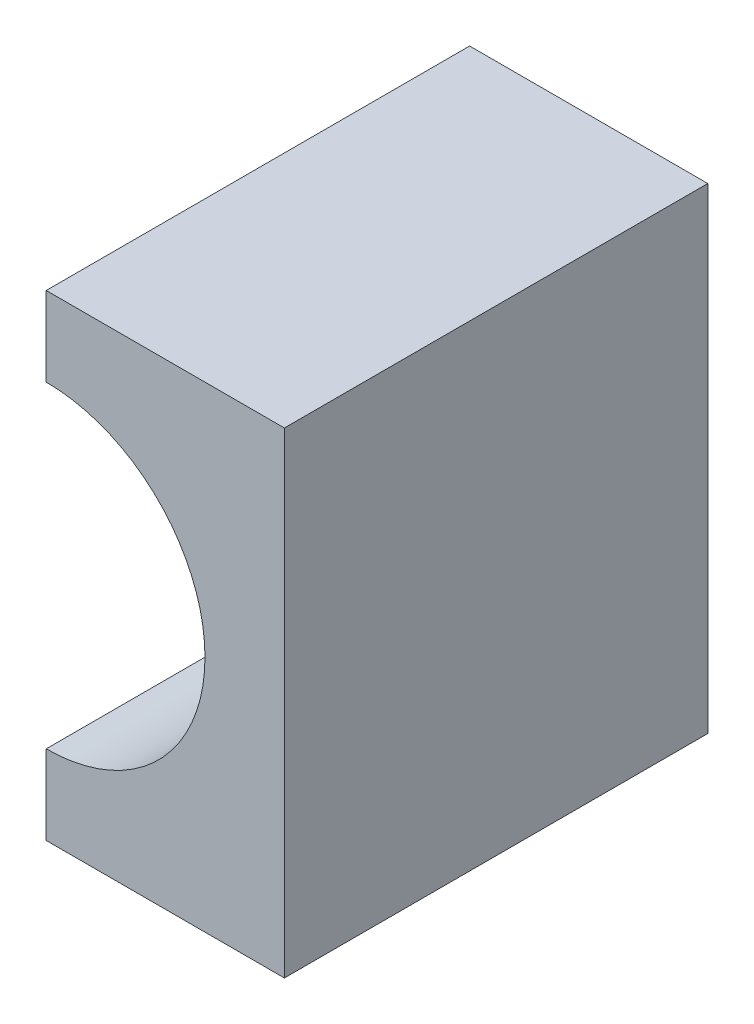
ISO-10303-21;
HEADER;
FILE_DESCRIPTION(('STEP AP214'),'2;1');
FILE_NAME('part.step','',(''),(''),'','','');
FILE_SCHEMA(('AUTOMOTIVE_DESIGN { 1 0 10303 214 1 1 1 1 }'));
ENDSEC;
DATA;
#1=APPLICATION_CONTEXT('core data for automotive mechanical design processes');
#2=APPLICATION_PROTOCOL_DEFINITION('international standard','automotive_design',2000,#1);
#3=PRODUCT_CONTEXT('',#1,'mechanical');
#4=PRODUCT('Part','Part','',(#3));
#5=PRODUCT_RELATED_PRODUCT_CATEGORY('part','',(#4));
#6=PRODUCT_DEFINITION_FORMATION('','',#4);
#7=PRODUCT_DEFINITION_CONTEXT('part definition',#1,'design');
#8=PRODUCT_DEFINITION('design','',#6,#7);
#9=PRODUCT_DEFINITION_SHAPE('','',#8);
#10=(LENGTH_UNIT() NAMED_UNIT(*) SI_UNIT(.MILLI.,.METRE.));
#11=(NAMED_UNIT(*) PLANE_ANGLE_UNIT() SI_UNIT($,.RADIAN.));
#12=(NAMED_UNIT(*) SI_UNIT($,.STERADIAN.) SOLID_ANGLE_UNIT());
#13=UNCERTAINTY_MEASURE_WITH_UNIT(LENGTH_MEASURE(1.E-05),#10,'distance_accuracy_value','');
#14=(GEOMETRIC_REPRESENTATION_CONTEXT(3) GLOBAL_UNCERTAINTY_ASSIGNED_CONTEXT((#13)) GLOBAL_UNIT_ASSIGNED_CONTEXT((#10,
#11,#12)) REPRESENTATION_CONTEXT('',''));
#15=CARTESIAN_POINT('',(0.,0.,0.));
#16=DIRECTION('',(0.,0.,1.));
#17=DIRECTION('',(1.,0.,0.));
#18=AXIS2_PLACEMENT_3D('',#15,#16,#17);
#19=CARTESIAN_POINT('',(0.45,22.45,0.));
#20=DIRECTION('',(0.,1.,0.));
#21=DIRECTION('',(-1.,0.,0.));
#22=AXIS2_PLACEMENT_3D('',#19,#20,#21);
#23=PLANE('',#22);
#24=DIRECTION('',(1.,0.,0.));
#25=VECTOR('',#24,1.);
#26=CARTESIAN_POINT('',(0.,22.45,0.));
#27=LINE('',#26,#25);
#28=CARTESIAN_POINT('',(0.,22.45,0.));
#29=VERTEX_POINT('',#28);
#30=CARTESIAN_POINT('',(0.45,22.45,0.));
#31=VERTEX_POINT('',#30);
#32=EDGE_CURVE('E11',#29,#31,#27,.T.);
#33=ORIENTED_EDGE('',*,*,#32,.F.);
#34=DIRECTION('',(0.,0.,1.));
#35=VECTOR('',#34,1.);
#36=CARTESIAN_POINT('',(0.,22.45,0.));
#37=LINE('',#36,#35);
#38=CARTESIAN_POINT('',(0.,22.45,0.8));
#39=VERTEX_POINT('',#38);
#40=EDGE_CURVE('E24',#29,#39,#37,.T.);
#41=ORIENTED_EDGE('',*,*,#40,.T.);
#42=DIRECTION('',(-1.,0.,0.));
#43=VECTOR('',#42,1.);
#44=CARTESIAN_POINT('',(0.,22.45,0.8));
#45=LINE('',#44,#43);
#46=CARTESIAN_POINT('',(0.45,22.45,0.8));
#47=VERTEX_POINT('',#46);
#48=EDGE_CURVE('E88',#47,#39,#45,.T.);
#49=ORIENTED_EDGE('',*,*,#48,.F.);
#50=DIRECTION('',(0.,0.,1.));
#51=VECTOR('',#50,1.);
#52=CARTESIAN_POINT('',(0.45,22.45,0.));
#53=LINE('',#52,#51);
#54=EDGE_CURVE('E114',#31,#47,#53,.T.);
#55=ORIENTED_EDGE('',*,*,#54,.F.);
#56=EDGE_LOOP('',(#33,#41,#49,#55));
#57=FACE_BOUND('',#56,.T.);
#58=ADVANCED_FACE('F17',(#57),#23,.T.);
#59=CARTESIAN_POINT('',(0.45,21.55,0.));
#60=DIRECTION('',(1.,0.,0.));
#61=DIRECTION('',(0.,1.,0.));
#62=AXIS2_PLACEMENT_3D('',#59,#60,#61);
#63=PLANE('',#62);
#64=DIRECTION('',(0.,-1.,0.));
#65=VECTOR('',#64,1.);
#66=CARTESIAN_POINT('',(0.45,22.45,0.));
#67=LINE('',#66,#65);
#68=CARTESIAN_POINT('',(0.45,21.55,0.));
#69=VERTEX_POINT('',#68);
#70=EDGE_CURVE('E112',#31,#69,#67,.T.);
#71=ORIENTED_EDGE('',*,*,#70,.F.);
#72=ORIENTED_EDGE('',*,*,#54,.T.);
#73=DIRECTION('',(0.,1.,0.));
#74=VECTOR('',#73,1.);
#75=CARTESIAN_POINT('',(0.45,22.45,0.8));
#76=LINE('',#75,#74);
#77=CARTESIAN_POINT('',(0.45,21.55,0.8));
#78=VERTEX_POINT('',#77);
#79=EDGE_CURVE('E110',#78,#47,#76,.T.);
#80=ORIENTED_EDGE('',*,*,#79,.F.);
#81=DIRECTION('',(0.,0.,1.));
#82=VECTOR('',#81,1.);
#83=CARTESIAN_POINT('',(0.45,21.55,0.));
#84=LINE('',#83,#82);
#85=EDGE_CURVE('E107',#69,#78,#84,.T.);
#86=ORIENTED_EDGE('',*,*,#85,.F.);
#87=EDGE_LOOP('',(#71,#72,#80,#86));
#88=FACE_BOUND('',#87,.T.);
#89=ADVANCED_FACE('F127',(#88),#63,.T.);
#90=CARTESIAN_POINT('',(0.,21.55,0.));
#91=DIRECTION('',(0.,-1.,0.));
#92=DIRECTION('',(1.,0.,0.));
#93=AXIS2_PLACEMENT_3D('',#90,#91,#92);
#94=PLANE('',#93);
#95=DIRECTION('',(-1.,0.,0.));
#96=VECTOR('',#95,1.);
#97=CARTESIAN_POINT('',(0.45,21.55,0.));
#98=LINE('',#97,#96);
#99=CARTESIAN_POINT('',(0.,21.55,0.));
#100=VERTEX_POINT('',#99);
#101=EDGE_CURVE('E105',#69,#100,#98,.T.);
#102=ORIENTED_EDGE('',*,*,#101,.F.);
#103=ORIENTED_EDGE('',*,*,#85,.T.);
#104=DIRECTION('',(1.,0.,0.));
#105=VECTOR('',#104,1.);
#106=CARTESIAN_POINT('',(0.45,21.55,0.8));
#107=LINE('',#106,#105);
#108=CARTESIAN_POINT('',(0.,21.55,0.8));
#109=VERTEX_POINT('',#108);
#110=EDGE_CURVE('E102',#109,#78,#107,.T.);
#111=ORIENTED_EDGE('',*,*,#110,.F.);
#112=DIRECTION('',(0.,0.,1.));
#113=VECTOR('',#112,1.);
#114=CARTESIAN_POINT('',(0.,21.55,0.));
#115=LINE('',#114,#113);
#116=EDGE_CURVE('E99',#100,#109,#115,.T.);
#117=ORIENTED_EDGE('',*,*,#116,.F.);
#118=EDGE_LOOP('',(#102,#103,#111,#117));
#119=FACE_BOUND('',#118,.T.);
#120=ADVANCED_FACE('F123',(#119),#94,.T.);
#121=CARTESIAN_POINT('',(0.,21.7000000290573,0.));
#122=DIRECTION('',(-1.,0.,0.));
#123=DIRECTION('',(0.,-1.,0.));
#124=AXIS2_PLACEMENT_3D('',#121,#122,#123);
#125=PLANE('',#124);
#126=DIRECTION('',(0.,-1.,0.));
#127=VECTOR('',#126,1.);
#128=CARTESIAN_POINT('',(0.,31.,0.));
#129=LINE('',#128,#127);
#130=CARTESIAN_POINT('',(0.,21.7000000290573,0.));
#131=VERTEX_POINT('',#130);
#132=EDGE_CURVE('E96',#131,#100,#129,.T.);
#133=ORIENTED_EDGE('',*,*,#132,.T.);
#134=ORIENTED_EDGE('',*,*,#116,.T.);
#135=DIRECTION('',(0.,-1.,0.));
#136=VECTOR('',#135,1.);
#137=CARTESIAN_POINT('',(0.,31.,0.8));
#138=LINE('',#137,#136);
#139=CARTESIAN_POINT('',(0.,21.7000000290573,0.8));
#140=VERTEX_POINT('',#139);
#141=EDGE_CURVE('E94',#140,#109,#138,.T.);
#142=ORIENTED_EDGE('',*,*,#141,.F.);
#143=DIRECTION('',(0.,0.,1.));
#144=VECTOR('',#143,1.);
#145=CARTESIAN_POINT('',(0.,21.7000000290573,0.));
#146=LINE('',#145,#144);
#147=EDGE_CURVE('E80',#131,#140,#146,.T.);
#148=ORIENTED_EDGE('',*,*,#147,.F.);
#149=EDGE_LOOP('',(#133,#134,#142,#148));
#150=FACE_BOUND('',#149,.T.);
#151=ADVANCED_FACE('F121',(#150),#125,.T.);
#152=CARTESIAN_POINT('',(0.,22.,0.));
#153=DIRECTION('',(0.,0.,1.));
#154=DIRECTION('',(0.,-1.,0.));
#155=AXIS2_PLACEMENT_3D('',#152,#153,#154);
#156=CYLINDRICAL_SURFACE('',#155,0.299999970942735);
#157=CARTESIAN_POINT('',(0.,22.,0.));
#158=DIRECTION('',(0.,0.,1.));
#159=DIRECTION('',(0.,-1.,0.));
#160=AXIS2_PLACEMENT_3D('',#157,#158,#159);
#161=CIRCLE('',#160,0.299999970942735);
#162=CARTESIAN_POINT('',(0.,22.2999999709427,0.));
#163=VERTEX_POINT('',#162);
#164=EDGE_CURVE('E83',#131,#163,#161,.T.);
#165=ORIENTED_EDGE('',*,*,#164,.F.);
#166=ORIENTED_EDGE('',*,*,#147,.T.);
#167=CARTESIAN_POINT('',(0.,22.,0.8));
#168=DIRECTION('',(0.,0.,-1.));
#169=DIRECTION('',(0.,-1.,0.));
#170=AXIS2_PLACEMENT_3D('',#167,#168,#169);
#171=CIRCLE('',#170,0.299999970942735);
#172=CARTESIAN_POINT('',(0.,22.2999999709427,0.8));
#173=VERTEX_POINT('',#172);
#174=EDGE_CURVE('E74',#173,#140,#171,.T.);
#175=ORIENTED_EDGE('',*,*,#174,.F.);
#176=DIRECTION('',(0.,0.,1.));
#177=VECTOR('',#176,1.);
#178=CARTESIAN_POINT('',(0.,22.2999999709427,0.));
#179=LINE('',#178,#177);
#180=EDGE_CURVE('E65',#163,#173,#179,.T.);
#181=ORIENTED_EDGE('',*,*,#180,.F.);
#182=EDGE_LOOP('',(#165,#166,#175,#181));
#183=FACE_BOUND('',#182,.T.);
#184=ADVANCED_FACE('F78',(#183),#156,.F.);
#185=CARTESIAN_POINT('',(0.,22.45,0.));
#186=DIRECTION('',(-1.,0.,0.));
#187=DIRECTION('',(0.,-1.,0.));
#188=AXIS2_PLACEMENT_3D('',#185,#186,#187);
#189=PLANE('',#188);
#190=DIRECTION('',(0.,-1.,0.));
#191=VECTOR('',#190,1.);
#192=CARTESIAN_POINT('',(0.,31.,0.));
#193=LINE('',#192,#191);
#194=EDGE_CURVE('E70',#29,#163,#193,.T.);
#195=ORIENTED_EDGE('',*,*,#194,.T.);
#196=ORIENTED_EDGE('',*,*,#180,.T.);
#197=DIRECTION('',(0.,-1.,0.));
#198=VECTOR('',#197,1.);
#199=CARTESIAN_POINT('',(0.,31.,0.8));
#200=LINE('',#199,#198);
#201=EDGE_CURVE('E69',#39,#173,#200,.T.);
#202=ORIENTED_EDGE('',*,*,#201,.F.);
#203=ORIENTED_EDGE('',*,*,#40,.F.);
#204=EDGE_LOOP('',(#195,#196,#202,#203));
#205=FACE_BOUND('',#204,.T.);
#206=ADVANCED_FACE('F67',(#205),#189,.T.);
#207=CARTESIAN_POINT('',(0.225,22.,0.8));
#208=DIRECTION('',(0.,0.,1.));
#209=DIRECTION('',(1.,0.,0.));
#210=AXIS2_PLACEMENT_3D('',#207,#208,#209);
#211=PLANE('',#210);
#212=ORIENTED_EDGE('',*,*,#201,.T.);
#213=ORIENTED_EDGE('',*,*,#174,.T.);
#214=ORIENTED_EDGE('',*,*,#141,.T.);
#215=ORIENTED_EDGE('',*,*,#110,.T.);
#216=ORIENTED_EDGE('',*,*,#79,.T.);
#217=ORIENTED_EDGE('',*,*,#48,.T.);
#218=EDGE_LOOP('',(#212,#213,#214,#215,#216,#217));
#219=FACE_BOUND('',#218,.T.);
#220=ADVANCED_FACE('F86',(#219),#211,.T.);
#221=CARTESIAN_POINT('',(0.225,22.,0.));
#222=DIRECTION('',(0.,0.,1.));
#223=DIRECTION('',(1.,0.,0.));
#224=AXIS2_PLACEMENT_3D('',#221,#222,#223);
#225=PLANE('',#224);
#226=ORIENTED_EDGE('',*,*,#194,.F.);
#227=ORIENTED_EDGE('',*,*,#32,.T.);
#228=ORIENTED_EDGE('',*,*,#70,.T.);
#229=ORIENTED_EDGE('',*,*,#101,.T.);
#230=ORIENTED_EDGE('',*,*,#132,.F.);
#231=ORIENTED_EDGE('',*,*,#164,.T.);
#232=EDGE_LOOP('',(#226,#227,#228,#229,#230,#231));
#233=FACE_BOUND('',#232,.T.);
#234=ADVANCED_FACE('F117',(#233),#225,.F.);
#235=CLOSED_SHELL('',(#58,#89,#120,#151,#184,#206,#220,#234));
#236=MANIFOLD_SOLID_BREP('B1',#235);
#237=ADVANCED_BREP_SHAPE_REPRESENTATION('',(#18,#236),#14);
#238=SHAPE_DEFINITION_REPRESENTATION(#9,#237);
ENDSEC;
END-ISO-10303-21;
